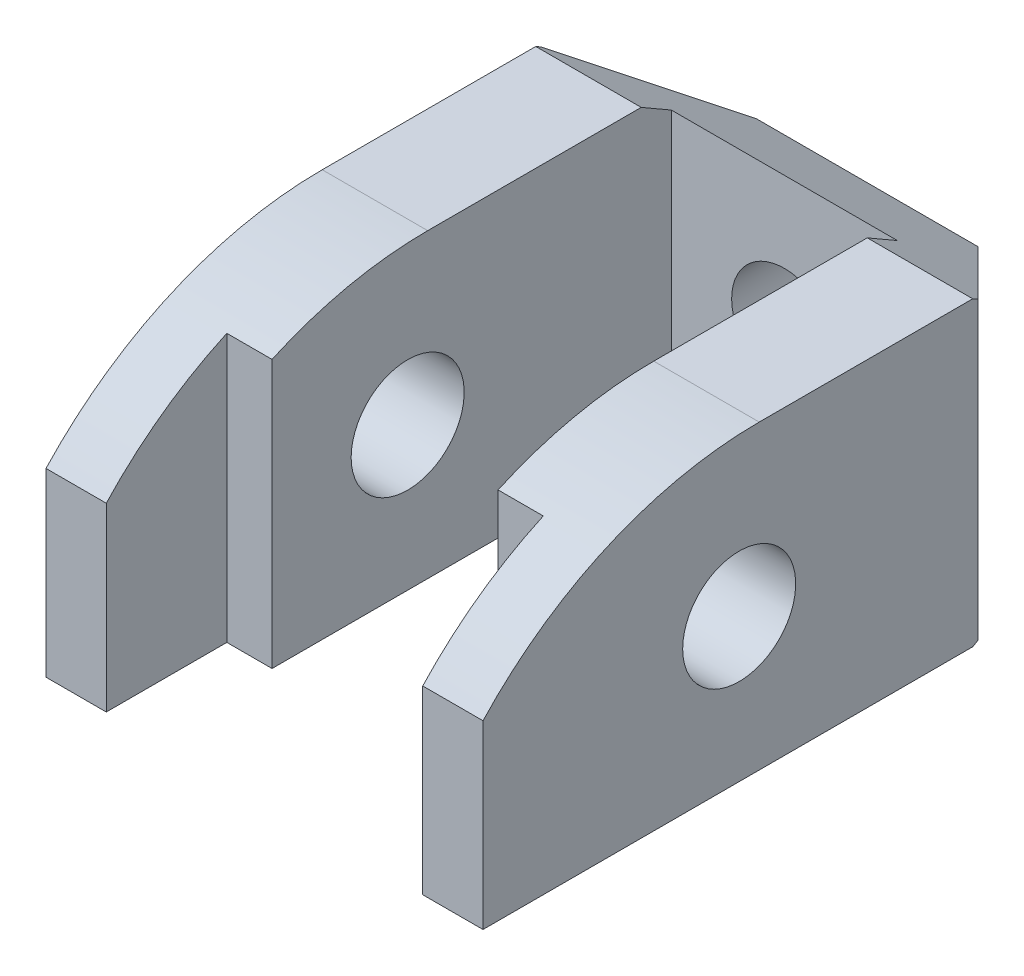
ISO-10303-21;
HEADER;
FILE_DESCRIPTION(('STEP AP214'),'2;1');
FILE_NAME('part.step','',(''),(''),'','','');
FILE_SCHEMA(('AUTOMOTIVE_DESIGN { 1 0 10303 214 1 1 1 1 }'));
ENDSEC;
DATA;
#1=APPLICATION_CONTEXT('core data for automotive mechanical design processes');
#2=APPLICATION_PROTOCOL_DEFINITION('international standard','automotive_design',2000,#1);
#3=PRODUCT_CONTEXT('',#1,'mechanical');
#4=PRODUCT('Part','Part','',(#3));
#5=PRODUCT_RELATED_PRODUCT_CATEGORY('part','',(#4));
#6=PRODUCT_DEFINITION_FORMATION('','',#4);
#7=PRODUCT_DEFINITION_CONTEXT('part definition',#1,'design');
#8=PRODUCT_DEFINITION('design','',#6,#7);
#9=PRODUCT_DEFINITION_SHAPE('','',#8);
#10=(LENGTH_UNIT() NAMED_UNIT(*) SI_UNIT(.MILLI.,.METRE.));
#11=(NAMED_UNIT(*) PLANE_ANGLE_UNIT() SI_UNIT($,.RADIAN.));
#12=(NAMED_UNIT(*) SI_UNIT($,.STERADIAN.) SOLID_ANGLE_UNIT());
#13=UNCERTAINTY_MEASURE_WITH_UNIT(LENGTH_MEASURE(1.E-05),#10,'distance_accuracy_value','');
#14=(GEOMETRIC_REPRESENTATION_CONTEXT(3) GLOBAL_UNCERTAINTY_ASSIGNED_CONTEXT((#13)) GLOBAL_UNIT_ASSIGNED_CONTEXT((#10,
#11,#12)) REPRESENTATION_CONTEXT('',''));
#15=CARTESIAN_POINT('',(0.,0.,0.));
#16=DIRECTION('',(0.,0.,1.));
#17=DIRECTION('',(1.,0.,0.));
#18=AXIS2_PLACEMENT_3D('',#15,#16,#17);
#19=CARTESIAN_POINT('',(58.,0.,-65.));
#20=DIRECTION('',(0.,0.866025403784438,0.500000000000001));
#21=DIRECTION('',(0.,-0.500000000000001,0.866025403784438));
#22=AXIS2_PLACEMENT_3D('',#19,#20,#21);
#23=PLANE('',#22);
#24=DIRECTION('',(-0.654653670707973,-0.37796447300923,0.65465367070798));
#25=VECTOR('',#24,1.);
#26=CARTESIAN_POINT('',(24.4590496401407,14.5236575393553,-90.1557127698941));
#27=LINE('',#26,#25);
#28=CARTESIAN_POINT('',(14.3033368702467,8.66025403784441,-80.));
#29=VERTEX_POINT('',#28);
#30=CARTESIAN_POINT('',(0.,0.402218645497464,-65.6966631297531));
#31=VERTEX_POINT('',#30);
#32=EDGE_CURVE('E264',#29,#31,#27,.T.);
#33=ORIENTED_EDGE('',*,*,#32,.F.);
#34=DIRECTION('',(-1.,0.,0.));
#35=VECTOR('',#34,1.);
#36=CARTESIAN_POINT('',(58.,8.66025403784441,-80.));
#37=LINE('',#36,#35);
#38=CARTESIAN_POINT('',(43.6966631297533,8.66025403784441,-80.));
#39=VERTEX_POINT('',#38);
#40=EDGE_CURVE('E235',#39,#29,#37,.T.);
#41=ORIENTED_EDGE('',*,*,#40,.F.);
#42=DIRECTION('',(0.654653670707972,-0.377964473009231,0.654653670707981));
#43=VECTOR('',#42,1.);
#44=CARTESIAN_POINT('',(58.3980932170018,0.172379419498898,-65.2985699127513));
#45=LINE('',#44,#43);
#46=CARTESIAN_POINT('',(58.,0.402218645497436,-65.6966631297531));
#47=VERTEX_POINT('',#46);
#48=EDGE_CURVE('E52',#39,#47,#45,.T.);
#49=ORIENTED_EDGE('',*,*,#48,.T.);
#50=DIRECTION('',(0.,0.500000000000001,-0.866025403784438));
#51=VECTOR('',#50,1.);
#52=CARTESIAN_POINT('',(58.,0.,-65.));
#53=LINE('',#52,#51);
#54=CARTESIAN_POINT('',(58.,0.,-65.));
#55=VERTEX_POINT('',#54);
#56=EDGE_CURVE('E188',#55,#47,#53,.T.);
#57=ORIENTED_EDGE('',*,*,#56,.F.);
#58=DIRECTION('',(-1.,0.,0.));
#59=VECTOR('',#58,1.);
#60=CARTESIAN_POINT('',(58.,0.,-65.));
#61=LINE('',#60,#59);
#62=CARTESIAN_POINT('',(44.,0.,-65.));
#63=VERTEX_POINT('',#62);
#64=EDGE_CURVE('E239',#55,#63,#61,.T.);
#65=ORIENTED_EDGE('',*,*,#64,.T.);
#66=DIRECTION('',(0.,0.500000000000001,-0.866025403784438));
#67=VECTOR('',#66,1.);
#68=CARTESIAN_POINT('',(44.,0.,-65.));
#69=LINE('',#68,#67);
#70=CARTESIAN_POINT('',(44.,2.30940107675851,-69.));
#71=VERTEX_POINT('',#70);
#72=EDGE_CURVE('E317',#63,#71,#69,.T.);
#73=ORIENTED_EDGE('',*,*,#72,.T.);
#74=DIRECTION('',(-1.,0.,0.));
#75=VECTOR('',#74,1.);
#76=CARTESIAN_POINT('',(58.,2.30940107675851,-69.));
#77=LINE('',#76,#75);
#78=CARTESIAN_POINT('',(14.,2.30940107675852,-69.));
#79=VERTEX_POINT('',#78);
#80=EDGE_CURVE('E330',#71,#79,#77,.T.);
#81=ORIENTED_EDGE('',*,*,#80,.T.);
#82=DIRECTION('',(0.,0.500000000000001,-0.866025403784438));
#83=VECTOR('',#82,1.);
#84=CARTESIAN_POINT('',(14.,0.,-65.));
#85=LINE('',#84,#83);
#86=CARTESIAN_POINT('',(14.,0.,-65.));
#87=VERTEX_POINT('',#86);
#88=EDGE_CURVE('E326',#87,#79,#85,.T.);
#89=ORIENTED_EDGE('',*,*,#88,.F.);
#90=CARTESIAN_POINT('',(0.,0.,-65.));
#91=VERTEX_POINT('',#90);
#92=EDGE_CURVE('E238',#87,#91,#61,.T.);
#93=ORIENTED_EDGE('',*,*,#92,.T.);
#94=DIRECTION('',(0.,0.500000000000001,-0.866025403784438));
#95=VECTOR('',#94,1.);
#96=CARTESIAN_POINT('',(0.,0.,-65.));
#97=LINE('',#96,#95);
#98=EDGE_CURVE('E212',#91,#31,#97,.T.);
#99=ORIENTED_EDGE('',*,*,#98,.T.);
#100=EDGE_LOOP('',(#33,#41,#49,#57,#65,#73,#81,#89,#93,#99));
#101=FACE_BOUND('',#100,.T.);
#102=ADVANCED_FACE('F36',(#101),#23,.F.);
#103=CARTESIAN_POINT('',(58.,31.3397459621557,-80.));
#104=DIRECTION('',(0.,-0.866025403784442,0.499999999999994));
#105=DIRECTION('',(0.,-0.499999999999994,-0.866025403784442));
#106=AXIS2_PLACEMENT_3D('',#103,#104,#105);
#107=PLANE('',#106);
#108=DIRECTION('',(0.654653670707975,-0.377964473009224,-0.654653670707982));
#109=VECTOR('',#108,1.);
#110=CARTESIAN_POINT('',(33.0304782115694,20.527625867591,-98.7271413413229));
#111=LINE('',#110,#109);
#112=CARTESIAN_POINT('',(0.,39.5977813545025,-65.6966631297531));
#113=VERTEX_POINT('',#112);
#114=CARTESIAN_POINT('',(14.3033368702467,31.3397459621557,-80.));
#115=VERTEX_POINT('',#114);
#116=EDGE_CURVE('E59',#113,#115,#111,.T.);
#117=ORIENTED_EDGE('',*,*,#116,.F.);
#118=DIRECTION('',(0.,0.499999999999994,0.866025403784442));
#119=VECTOR('',#118,1.);
#120=CARTESIAN_POINT('',(0.,31.3397459621557,-80.));
#121=LINE('',#120,#119);
#122=CARTESIAN_POINT('',(0.,40.,-65.));
#123=VERTEX_POINT('',#122);
#124=EDGE_CURVE('E215',#113,#123,#121,.T.);
#125=ORIENTED_EDGE('',*,*,#124,.T.);
#126=DIRECTION('',(-1.,0.,0.));
#127=VECTOR('',#126,1.);
#128=CARTESIAN_POINT('',(58.,40.,-65.));
#129=LINE('',#128,#127);
#130=CARTESIAN_POINT('',(14.,40.,-65.));
#131=VERTEX_POINT('',#130);
#132=EDGE_CURVE('E231',#131,#123,#129,.T.);
#133=ORIENTED_EDGE('',*,*,#132,.F.);
#134=DIRECTION('',(0.,0.499999999999994,0.866025403784442));
#135=VECTOR('',#134,1.);
#136=CARTESIAN_POINT('',(14.,31.3397459621557,-80.));
#137=LINE('',#136,#135);
#138=CARTESIAN_POINT('',(14.,37.6905989232415,-69.));
#139=VERTEX_POINT('',#138);
#140=EDGE_CURVE('E324',#139,#131,#137,.T.);
#141=ORIENTED_EDGE('',*,*,#140,.F.);
#142=DIRECTION('',(1.,0.,0.));
#143=VECTOR('',#142,1.);
#144=CARTESIAN_POINT('',(58.,37.6905989232415,-69.));
#145=LINE('',#144,#143);
#146=CARTESIAN_POINT('',(44.,37.6905989232415,-69.));
#147=VERTEX_POINT('',#146);
#148=EDGE_CURVE('E246',#139,#147,#145,.T.);
#149=ORIENTED_EDGE('',*,*,#148,.T.);
#150=DIRECTION('',(0.,0.499999999999994,0.866025403784442));
#151=VECTOR('',#150,1.);
#152=CARTESIAN_POINT('',(44.,31.3397459621557,-80.));
#153=LINE('',#152,#151);
#154=CARTESIAN_POINT('',(44.,40.,-65.));
#155=VERTEX_POINT('',#154);
#156=EDGE_CURVE('E315',#147,#155,#153,.T.);
#157=ORIENTED_EDGE('',*,*,#156,.T.);
#158=CARTESIAN_POINT('',(58.,40.,-65.));
#159=VERTEX_POINT('',#158);
#160=EDGE_CURVE('E193',#159,#155,#129,.T.);
#161=ORIENTED_EDGE('',*,*,#160,.F.);
#162=DIRECTION('',(0.,0.499999999999994,0.866025403784442));
#163=VECTOR('',#162,1.);
#164=CARTESIAN_POINT('',(58.,31.3397459621557,-80.));
#165=LINE('',#164,#163);
#166=CARTESIAN_POINT('',(58.,39.5977813545026,-65.6966631297531));
#167=VERTEX_POINT('',#166);
#168=EDGE_CURVE('E185',#167,#159,#165,.T.);
#169=ORIENTED_EDGE('',*,*,#168,.F.);
#170=DIRECTION('',(-0.654653670707973,-0.377964473009224,-0.654653670707983));
#171=VECTOR('',#170,1.);
#172=CARTESIAN_POINT('',(49.8266646455732,34.8789039874472,-73.86999848418));
#173=LINE('',#172,#171);
#174=CARTESIAN_POINT('',(43.6966631297533,31.3397459621557,-80.));
#175=VERTEX_POINT('',#174);
#176=EDGE_CURVE('E171',#167,#175,#173,.T.);
#177=ORIENTED_EDGE('',*,*,#176,.T.);
#178=DIRECTION('',(-1.,0.,0.));
#179=VECTOR('',#178,1.);
#180=CARTESIAN_POINT('',(58.,31.3397459621557,-80.));
#181=LINE('',#180,#179);
#182=EDGE_CURVE('E233',#175,#115,#181,.T.);
#183=ORIENTED_EDGE('',*,*,#182,.T.);
#184=EDGE_LOOP('',(#117,#125,#133,#141,#149,#157,#161,#169,#177,#183));
#185=FACE_BOUND('',#184,.T.);
#186=ADVANCED_FACE('F190',(#185),#107,.F.);
#187=CARTESIAN_POINT('',(0.,-10.,-36.6606055596467));
#188=DIRECTION('',(1.,0.,0.));
#189=DIRECTION('',(0.,0.,-1.));
#190=AXIS2_PLACEMENT_3D('',#187,#188,#189);
#191=PLANE('',#190);
#192=CARTESIAN_POINT('',(0.,19.,-34.));
#193=DIRECTION('',(1.,0.,0.));
#194=DIRECTION('',(0.,0.,-1.));
#195=AXIS2_PLACEMENT_3D('',#192,#193,#194);
#196=CIRCLE('',#195,7.5);
#197=CARTESIAN_POINT('',(0.,19.,-26.5));
#198=VERTEX_POINT('',#197);
#199=EDGE_CURVE('E333',#198,#198,#196,.T.);
#200=ORIENTED_EDGE('',*,*,#199,.T.);
#201=EDGE_LOOP('',(#200));
#202=FACE_BOUND('',#201,.T.);
#203=DIRECTION('',(0.,-1.,0.));
#204=VECTOR('',#203,1.);
#205=CARTESIAN_POINT('',(0.,40.,-65.6966631297531));
#206=LINE('',#205,#204);
#207=EDGE_CURVE('E179',#113,#31,#206,.T.);
#208=ORIENTED_EDGE('',*,*,#207,.T.);
#209=ORIENTED_EDGE('',*,*,#98,.F.);
#210=DIRECTION('',(0.,0.,-1.));
#211=VECTOR('',#210,1.);
#212=CARTESIAN_POINT('',(0.,0.,0.));
#213=LINE('',#212,#211);
#214=CARTESIAN_POINT('',(0.,0.,0.));
#215=VERTEX_POINT('',#214);
#216=EDGE_CURVE('E208',#215,#91,#213,.T.);
#217=ORIENTED_EDGE('',*,*,#216,.F.);
#218=DIRECTION('',(0.,-1.,0.));
#219=VECTOR('',#218,1.);
#220=CARTESIAN_POINT('',(0.,0.,0.));
#221=LINE('',#220,#219);
#222=CARTESIAN_POINT('',(0.,24.,0.));
#223=VERTEX_POINT('',#222);
#224=EDGE_CURVE('E205',#223,#215,#221,.T.);
#225=ORIENTED_EDGE('',*,*,#224,.F.);
#226=CARTESIAN_POINT('',(0.,-10.,-36.6606055596467));
#227=DIRECTION('',(1.,0.,0.));
#228=DIRECTION('',(0.,0.,-1.));
#229=AXIS2_PLACEMENT_3D('',#226,#227,#228);
#230=CIRCLE('',#229,50.);
#231=CARTESIAN_POINT('',(0.,40.,-36.6606055596467));
#232=VERTEX_POINT('',#231);
#233=EDGE_CURVE('E220',#232,#223,#230,.T.);
#234=ORIENTED_EDGE('',*,*,#233,.F.);
#235=DIRECTION('',(0.,0.,1.));
#236=VECTOR('',#235,1.);
#237=CARTESIAN_POINT('',(0.,40.,-65.));
#238=LINE('',#237,#236);
#239=EDGE_CURVE('E217',#123,#232,#238,.T.);
#240=ORIENTED_EDGE('',*,*,#239,.F.);
#241=ORIENTED_EDGE('',*,*,#124,.F.);
#242=EDGE_LOOP('',(#208,#209,#217,#225,#234,#240,#241));
#243=FACE_BOUND('',#242,.T.);
#244=ADVANCED_FACE('F368',(#202,#243),#191,.F.);
#245=CARTESIAN_POINT('',(58.,8.66025403784441,-80.));
#246=DIRECTION('',(0.,0.,1.));
#247=DIRECTION('',(1.,0.,0.));
#248=AXIS2_PLACEMENT_3D('',#245,#246,#247);
#249=PLANE('',#248);
#250=CARTESIAN_POINT('',(29.,20.0000000000001,-80.));
#251=DIRECTION('',(0.,0.,-1.));
#252=DIRECTION('',(-1.,0.,0.));
#253=AXIS2_PLACEMENT_3D('',#250,#251,#252);
#254=CIRCLE('',#253,7.);
#255=CARTESIAN_POINT('',(22.,20.0000000000001,-80.));
#256=VERTEX_POINT('',#255);
#257=EDGE_CURVE('E386',#256,#256,#254,.T.);
#258=ORIENTED_EDGE('',*,*,#257,.F.);
#259=EDGE_LOOP('',(#258));
#260=FACE_BOUND('',#259,.T.);
#261=DIRECTION('',(0.,-1.,0.));
#262=VECTOR('',#261,1.);
#263=CARTESIAN_POINT('',(14.3033368702467,8.66025403784441,-80.));
#264=LINE('',#263,#262);
#265=EDGE_CURVE('E12',#115,#29,#264,.T.);
#266=ORIENTED_EDGE('',*,*,#265,.F.);
#267=ORIENTED_EDGE('',*,*,#182,.F.);
#268=DIRECTION('',(0.,-1.,0.));
#269=VECTOR('',#268,1.);
#270=CARTESIAN_POINT('',(43.6966631297533,8.66025403784441,-80.));
#271=LINE('',#270,#269);
#272=EDGE_CURVE('E45',#175,#39,#271,.T.);
#273=ORIENTED_EDGE('',*,*,#272,.T.);
#274=ORIENTED_EDGE('',*,*,#40,.T.);
#275=EDGE_LOOP('',(#266,#267,#273,#274));
#276=FACE_BOUND('',#275,.T.);
#277=ADVANCED_FACE('F261',(#260,#276),#249,.F.);
#278=CARTESIAN_POINT('',(58.,0.,0.));
#279=DIRECTION('',(0.,1.,0.));
#280=DIRECTION('',(0.,0.,1.));
#281=AXIS2_PLACEMENT_3D('',#278,#279,#280);
#282=PLANE('',#281);
#283=DIRECTION('',(0.,0.,1.));
#284=VECTOR('',#283,1.);
#285=CARTESIAN_POINT('',(50.,0.,0.));
#286=LINE('',#285,#284);
#287=CARTESIAN_POINT('',(50.,0.,-16.));
#288=VERTEX_POINT('',#287);
#289=CARTESIAN_POINT('',(50.,0.,0.));
#290=VERTEX_POINT('',#289);
#291=EDGE_CURVE('E297',#288,#290,#286,.T.);
#292=ORIENTED_EDGE('',*,*,#291,.F.);
#293=DIRECTION('',(-1.,0.,0.));
#294=VECTOR('',#293,1.);
#295=CARTESIAN_POINT('',(58.,0.,-16.));
#296=LINE('',#295,#294);
#297=CARTESIAN_POINT('',(44.,0.,-16.));
#298=VERTEX_POINT('',#297);
#299=EDGE_CURVE('E291',#288,#298,#296,.T.);
#300=ORIENTED_EDGE('',*,*,#299,.T.);
#301=DIRECTION('',(0.,0.,-1.));
#302=VECTOR('',#301,1.);
#303=CARTESIAN_POINT('',(44.,0.,0.));
#304=LINE('',#303,#302);
#305=EDGE_CURVE('E256',#298,#63,#304,.T.);
#306=ORIENTED_EDGE('',*,*,#305,.T.);
#307=ORIENTED_EDGE('',*,*,#64,.F.);
#308=DIRECTION('',(0.,0.,-1.));
#309=VECTOR('',#308,1.);
#310=CARTESIAN_POINT('',(58.,0.,0.));
#311=LINE('',#310,#309);
#312=CARTESIAN_POINT('',(58.,0.,0.));
#313=VERTEX_POINT('',#312);
#314=EDGE_CURVE('E199',#313,#55,#311,.T.);
#315=ORIENTED_EDGE('',*,*,#314,.F.);
#316=DIRECTION('',(-1.,0.,0.));
#317=VECTOR('',#316,1.);
#318=CARTESIAN_POINT('',(58.,0.,0.));
#319=LINE('',#318,#317);
#320=EDGE_CURVE('E243',#313,#290,#319,.T.);
#321=ORIENTED_EDGE('',*,*,#320,.T.);
#322=EDGE_LOOP('',(#292,#300,#306,#307,#315,#321));
#323=FACE_BOUND('',#322,.T.);
#324=ADVANCED_FACE('F344',(#323),#282,.F.);
#325=CARTESIAN_POINT('',(58.,-10.,-36.6606055596467));
#326=DIRECTION('',(-1.,0.,0.));
#327=DIRECTION('',(0.,0.,1.));
#328=AXIS2_PLACEMENT_3D('',#325,#326,#327);
#329=CYLINDRICAL_SURFACE('',#328,50.);
#330=CARTESIAN_POINT('',(50.,-10.,-36.6606055596467));
#331=DIRECTION('',(-1.,0.,0.));
#332=DIRECTION('',(0.,0.,1.));
#333=AXIS2_PLACEMENT_3D('',#330,#331,#332);
#334=CIRCLE('',#333,50.);
#335=CARTESIAN_POINT('',(50.,35.5317403347236,-16.));
#336=VERTEX_POINT('',#335);
#337=CARTESIAN_POINT('',(50.,24.,0.));
#338=VERTEX_POINT('',#337);
#339=EDGE_CURVE('E274',#336,#338,#334,.F.);
#340=ORIENTED_EDGE('',*,*,#339,.T.);
#341=DIRECTION('',(-1.,0.,0.));
#342=VECTOR('',#341,1.);
#343=CARTESIAN_POINT('',(58.,24.,0.));
#344=LINE('',#343,#342);
#345=CARTESIAN_POINT('',(58.,24.,0.));
#346=VERTEX_POINT('',#345);
#347=EDGE_CURVE('E224',#346,#338,#344,.T.);
#348=ORIENTED_EDGE('',*,*,#347,.F.);
#349=CARTESIAN_POINT('',(58.,-10.,-36.6606055596467));
#350=DIRECTION('',(1.,0.,0.));
#351=DIRECTION('',(0.,0.,-1.));
#352=AXIS2_PLACEMENT_3D('',#349,#350,#351);
#353=CIRCLE('',#352,50.);
#354=CARTESIAN_POINT('',(58.,40.,-36.6606055596467));
#355=VERTEX_POINT('',#354);
#356=EDGE_CURVE('E197',#355,#346,#353,.T.);
#357=ORIENTED_EDGE('',*,*,#356,.F.);
#358=DIRECTION('',(-1.,0.,0.));
#359=VECTOR('',#358,1.);
#360=CARTESIAN_POINT('',(58.,40.,-36.6606055596467));
#361=LINE('',#360,#359);
#362=CARTESIAN_POINT('',(44.,40.,-36.6606055596467));
#363=VERTEX_POINT('',#362);
#364=EDGE_CURVE('E228',#355,#363,#361,.T.);
#365=ORIENTED_EDGE('',*,*,#364,.T.);
#366=CARTESIAN_POINT('',(44.,-10.,-36.6606055596467));
#367=DIRECTION('',(1.,0.,0.));
#368=DIRECTION('',(0.,0.,-1.));
#369=AXIS2_PLACEMENT_3D('',#366,#367,#368);
#370=CIRCLE('',#369,50.);
#371=CARTESIAN_POINT('',(44.,35.5317403347236,-16.));
#372=VERTEX_POINT('',#371);
#373=EDGE_CURVE('E250',#363,#372,#370,.T.);
#374=ORIENTED_EDGE('',*,*,#373,.T.);
#375=DIRECTION('',(-1.,0.,0.));
#376=VECTOR('',#375,1.);
#377=CARTESIAN_POINT('',(58.,35.5317403347236,-16.));
#378=LINE('',#377,#376);
#379=EDGE_CURVE('E269',#336,#372,#378,.T.);
#380=ORIENTED_EDGE('',*,*,#379,.F.);
#381=EDGE_LOOP('',(#340,#348,#357,#365,#374,#380));
#382=FACE_BOUND('',#381,.T.);
#383=ADVANCED_FACE('F419',(#382),#329,.T.);
#384=CARTESIAN_POINT('',(58.,0.,0.));
#385=DIRECTION('',(0.,0.,-1.));
#386=DIRECTION('',(-1.,0.,0.));
#387=AXIS2_PLACEMENT_3D('',#384,#385,#386);
#388=PLANE('',#387);
#389=DIRECTION('',(0.,-1.,0.));
#390=VECTOR('',#389,1.);
#391=CARTESIAN_POINT('',(50.,40.001,0.));
#392=LINE('',#391,#390);
#393=EDGE_CURVE('E285',#338,#290,#392,.T.);
#394=ORIENTED_EDGE('',*,*,#393,.T.);
#395=ORIENTED_EDGE('',*,*,#320,.F.);
#396=DIRECTION('',(0.,-1.,0.));
#397=VECTOR('',#396,1.);
#398=CARTESIAN_POINT('',(58.,0.,0.));
#399=LINE('',#398,#397);
#400=EDGE_CURVE('E223',#346,#313,#399,.T.);
#401=ORIENTED_EDGE('',*,*,#400,.F.);
#402=ORIENTED_EDGE('',*,*,#347,.T.);
#403=EDGE_LOOP('',(#394,#395,#401,#402));
#404=FACE_BOUND('',#403,.T.);
#405=ADVANCED_FACE('F411',(#404),#388,.F.);
#406=DIRECTION('',(0.,0.,-1.));
#407=VECTOR('',#406,1.);
#408=CARTESIAN_POINT('',(14.,0.,0.));
#409=LINE('',#408,#407);
#410=CARTESIAN_POINT('',(14.,0.,-16.));
#411=VERTEX_POINT('',#410);
#412=EDGE_CURVE('E328',#411,#87,#409,.T.);
#413=ORIENTED_EDGE('',*,*,#412,.F.);
#414=CARTESIAN_POINT('',(8.00000000000001,0.,-16.));
#415=VERTEX_POINT('',#414);
#416=EDGE_CURVE('E290',#411,#415,#296,.T.);
#417=ORIENTED_EDGE('',*,*,#416,.T.);
#418=DIRECTION('',(0.,0.,1.));
#419=VECTOR('',#418,1.);
#420=CARTESIAN_POINT('',(8.00000000000001,0.,0.));
#421=LINE('',#420,#419);
#422=CARTESIAN_POINT('',(8.00000000000001,0.,0.));
#423=VERTEX_POINT('',#422);
#424=EDGE_CURVE('E294',#415,#423,#421,.T.);
#425=ORIENTED_EDGE('',*,*,#424,.T.);
#426=EDGE_CURVE('E242',#423,#215,#319,.T.);
#427=ORIENTED_EDGE('',*,*,#426,.T.);
#428=ORIENTED_EDGE('',*,*,#216,.T.);
#429=ORIENTED_EDGE('',*,*,#92,.F.);
#430=EDGE_LOOP('',(#413,#417,#425,#427,#428,#429));
#431=FACE_BOUND('',#430,.T.);
#432=ADVANCED_FACE('F382',(#431),#282,.F.);
#433=CARTESIAN_POINT('',(58.,40.,-65.));
#434=DIRECTION('',(0.,-1.,0.));
#435=DIRECTION('',(0.,0.,-1.));
#436=AXIS2_PLACEMENT_3D('',#433,#434,#435);
#437=PLANE('',#436);
#438=DIRECTION('',(0.,0.,1.));
#439=VECTOR('',#438,1.);
#440=CARTESIAN_POINT('',(14.,40.,-69.));
#441=LINE('',#440,#439);
#442=CARTESIAN_POINT('',(14.,40.,-36.6606055596467));
#443=VERTEX_POINT('',#442);
#444=EDGE_CURVE('E302',#131,#443,#441,.T.);
#445=ORIENTED_EDGE('',*,*,#444,.F.);
#446=ORIENTED_EDGE('',*,*,#132,.T.);
#447=ORIENTED_EDGE('',*,*,#239,.T.);
#448=EDGE_CURVE('E227',#443,#232,#361,.T.);
#449=ORIENTED_EDGE('',*,*,#448,.F.);
#450=EDGE_LOOP('',(#445,#446,#447,#449));
#451=FACE_BOUND('',#450,.T.);
#452=ADVANCED_FACE('F364',(#451),#437,.F.);
#453=CARTESIAN_POINT('',(8.00000000000001,-10.,-36.6606055596467));
#454=DIRECTION('',(-1.,0.,0.));
#455=DIRECTION('',(0.,0.,1.));
#456=AXIS2_PLACEMENT_3D('',#453,#454,#455);
#457=CIRCLE('',#456,50.);
#458=CARTESIAN_POINT('',(8.00000000000001,35.5317403347236,-16.));
#459=VERTEX_POINT('',#458);
#460=CARTESIAN_POINT('',(8.00000000000003,24.,0.));
#461=VERTEX_POINT('',#460);
#462=EDGE_CURVE('E288',#459,#461,#457,.F.);
#463=ORIENTED_EDGE('',*,*,#462,.F.);
#464=CARTESIAN_POINT('',(14.,35.5317403347236,-16.));
#465=VERTEX_POINT('',#464);
#466=EDGE_CURVE('E267',#465,#459,#378,.T.);
#467=ORIENTED_EDGE('',*,*,#466,.F.);
#468=CARTESIAN_POINT('',(14.,-10.,-36.6606055596467));
#469=DIRECTION('',(1.,0.,0.));
#470=DIRECTION('',(0.,0.,-1.));
#471=AXIS2_PLACEMENT_3D('',#468,#469,#470);
#472=CIRCLE('',#471,50.);
#473=EDGE_CURVE('E255',#443,#465,#472,.T.);
#474=ORIENTED_EDGE('',*,*,#473,.F.);
#475=ORIENTED_EDGE('',*,*,#448,.T.);
#476=ORIENTED_EDGE('',*,*,#233,.T.);
#477=EDGE_CURVE('E204',#461,#223,#344,.T.);
#478=ORIENTED_EDGE('',*,*,#477,.F.);
#479=EDGE_LOOP('',(#463,#467,#474,#475,#476,#478));
#480=FACE_BOUND('',#479,.T.);
#481=ADVANCED_FACE('F374',(#480),#329,.T.);
#482=CARTESIAN_POINT('',(58.,19.,-34.));
#483=DIRECTION('',(-1.,0.,0.));
#484=DIRECTION('',(0.,0.,1.));
#485=AXIS2_PLACEMENT_3D('',#482,#483,#484);
#486=CYLINDRICAL_SURFACE('',#485,7.5);
#487=CARTESIAN_POINT('',(14.,19.,-34.));
#488=DIRECTION('',(1.,0.,0.));
#489=DIRECTION('',(0.,0.,-1.));
#490=AXIS2_PLACEMENT_3D('',#487,#488,#489);
#491=CIRCLE('',#490,7.5);
#492=CARTESIAN_POINT('',(14.,19.,-26.5));
#493=VERTEX_POINT('',#492);
#494=EDGE_CURVE('E252',#493,#493,#491,.T.);
#495=CARTESIAN_POINT('',(0.,19.,-26.5));
#496=CARTESIAN_POINT('',(0.145833333333333,19.,-26.5));
#497=CARTESIAN_POINT('',(0.291666666666667,19.,-26.5));
#498=CARTESIAN_POINT('',(0.583333333333334,19.,-26.5));
#499=CARTESIAN_POINT('',(0.729166666666667,19.,-26.5));
#500=CARTESIAN_POINT('',(1.02083333333333,19.,-26.5));
#501=CARTESIAN_POINT('',(1.16666666666667,19.,-26.5));
#502=CARTESIAN_POINT('',(1.45833333333333,19.,-26.5));
#503=CARTESIAN_POINT('',(1.60416666666667,19.,-26.5));
#504=CARTESIAN_POINT('',(1.89583333333334,19.,-26.5));
#505=CARTESIAN_POINT('',(2.04166666666667,19.,-26.5));
#506=CARTESIAN_POINT('',(2.33333333333334,19.,-26.5));
#507=CARTESIAN_POINT('',(2.47916666666667,19.,-26.5));
#508=CARTESIAN_POINT('',(2.77083333333334,19.,-26.5));
#509=CARTESIAN_POINT('',(2.91666666666667,19.,-26.5));
#510=CARTESIAN_POINT('',(3.20833333333334,19.,-26.5));
#511=CARTESIAN_POINT('',(3.35416666666667,19.,-26.5));
#512=CARTESIAN_POINT('',(3.64583333333334,19.,-26.5));
#513=CARTESIAN_POINT('',(3.79166666666667,19.,-26.5));
#514=CARTESIAN_POINT('',(4.08333333333334,19.,-26.5));
#515=CARTESIAN_POINT('',(4.22916666666667,19.,-26.5));
#516=CARTESIAN_POINT('',(4.52083333333334,19.,-26.5));
#517=CARTESIAN_POINT('',(4.66666666666667,19.,-26.5));
#518=CARTESIAN_POINT('',(4.95833333333334,19.,-26.5));
#519=CARTESIAN_POINT('',(5.10416666666667,19.,-26.5));
#520=CARTESIAN_POINT('',(5.39583333333334,19.,-26.5));
#521=CARTESIAN_POINT('',(5.54166666666667,19.,-26.5));
#522=CARTESIAN_POINT('',(5.83333333333334,19.,-26.5));
#523=CARTESIAN_POINT('',(5.97916666666667,19.,-26.5));
#524=CARTESIAN_POINT('',(6.27083333333334,19.,-26.5));
#525=CARTESIAN_POINT('',(6.41666666666667,19.,-26.5));
#526=CARTESIAN_POINT('',(6.70833333333334,19.,-26.5));
#527=CARTESIAN_POINT('',(6.85416666666667,19.,-26.5));
#528=CARTESIAN_POINT('',(7.14583333333334,19.,-26.5));
#529=CARTESIAN_POINT('',(7.29166666666667,19.,-26.5));
#530=CARTESIAN_POINT('',(7.58333333333334,19.,-26.5));
#531=CARTESIAN_POINT('',(7.72916666666667,19.,-26.5));
#532=CARTESIAN_POINT('',(8.02083333333334,19.,-26.5));
#533=CARTESIAN_POINT('',(8.16666666666667,19.,-26.5));
#534=CARTESIAN_POINT('',(8.45833333333334,19.,-26.5));
#535=CARTESIAN_POINT('',(8.60416666666667,19.,-26.5));
#536=CARTESIAN_POINT('',(8.89583333333334,19.,-26.5));
#537=CARTESIAN_POINT('',(9.04166666666667,19.,-26.5));
#538=CARTESIAN_POINT('',(9.33333333333334,19.,-26.5));
#539=CARTESIAN_POINT('',(9.47916666666667,19.,-26.5));
#540=CARTESIAN_POINT('',(9.77083333333334,19.,-26.5));
#541=CARTESIAN_POINT('',(9.91666666666668,19.,-26.5));
#542=CARTESIAN_POINT('',(10.2083333333333,19.,-26.5));
#543=CARTESIAN_POINT('',(10.3541666666667,19.,-26.5));
#544=CARTESIAN_POINT('',(10.6458333333333,19.,-26.5));
#545=CARTESIAN_POINT('',(10.7916666666667,19.,-26.5));
#546=CARTESIAN_POINT('',(11.0833333333333,19.,-26.5));
#547=CARTESIAN_POINT('',(11.2291666666667,19.,-26.5));
#548=CARTESIAN_POINT('',(11.5208333333333,19.,-26.5));
#549=CARTESIAN_POINT('',(11.6666666666667,19.,-26.5));
#550=CARTESIAN_POINT('',(11.9583333333333,19.,-26.5));
#551=CARTESIAN_POINT('',(12.1041666666667,19.,-26.5));
#552=CARTESIAN_POINT('',(12.3958333333333,19.,-26.5));
#553=CARTESIAN_POINT('',(12.5416666666667,19.,-26.5));
#554=CARTESIAN_POINT('',(12.8333333333333,19.,-26.5));
#555=CARTESIAN_POINT('',(12.9791666666667,19.,-26.5));
#556=CARTESIAN_POINT('',(13.2708333333333,19.,-26.5));
#557=CARTESIAN_POINT('',(13.4166666666667,19.,-26.5));
#558=CARTESIAN_POINT('',(13.7083333333333,19.,-26.5));
#559=CARTESIAN_POINT('',(13.8541666666667,19.,-26.5));
#560=CARTESIAN_POINT('',(14.,19.,-26.5));
#561=B_SPLINE_CURVE_WITH_KNOTS('',3,(#495,#496,#497,#498,#499,#500,#501,#502,#503,#504,#505,
#506,#507,#508,#509,#510,#511,#512,#513,#514,#515,#516,#517,#518,#519,#520,#521,#522,#523,#524,
#525,#526,#527,#528,#529,#530,#531,#532,#533,#534,#535,#536,#537,#538,#539,#540,#541,#542,#543,
#544,#545,#546,#547,#548,#549,#550,#551,#552,#553,#554,#555,#556,#557,#558,#559,#560),
.UNSPECIFIED.,.F.,.F.,(4,2,2,2,2,2,2,2,2,2,2,2,2,2,2,2,2,2,2,2,2,2,2,2,2,2,2,2,2,2,2,2,4),(0.,
0.4375,0.875000000000001,1.3125,1.75,2.1875,2.625,3.0625,3.5,3.9375,4.375,4.8125,5.25,
5.68750000000001,6.12500000000001,6.56250000000001,7.00000000000001,7.43750000000001,
7.87500000000001,8.31250000000001,8.75000000000001,9.18750000000001,9.62500000000001,10.0625,
10.5,10.9375,11.375,11.8125,12.25,12.6875,13.125,13.5625,14.),.UNSPECIFIED.);
#562=EDGE_CURVE('BSEAM442',#198,#493,#561,.T.);
#563=ORIENTED_EDGE('',*,*,#199,.F.);
#564=ORIENTED_EDGE('',*,*,#494,.T.);
#565=ORIENTED_EDGE('',*,*,#562,.T.);
#566=ORIENTED_EDGE('',*,*,#562,.F.);
#567=EDGE_LOOP('',(#563,#565,#564,#566));
#568=FACE_BOUND('',#567,.T.);
#569=ADVANCED_FACE('F442',(#568),#486,.F.);
#570=CARTESIAN_POINT('',(58.,-10.,-36.6606055596467));
#571=DIRECTION('',(1.,0.,0.));
#572=DIRECTION('',(0.,0.,-1.));
#573=AXIS2_PLACEMENT_3D('',#570,#571,#572);
#574=PLANE('',#573);
#575=DIRECTION('',(0.,-1.,0.));
#576=VECTOR('',#575,1.);
#577=CARTESIAN_POINT('',(58.,40.,-65.6966631297531));
#578=LINE('',#577,#576);
#579=EDGE_CURVE('E174',#167,#47,#578,.T.);
#580=ORIENTED_EDGE('',*,*,#579,.F.);
#581=ORIENTED_EDGE('',*,*,#168,.T.);
#582=DIRECTION('',(0.,0.,1.));
#583=VECTOR('',#582,1.);
#584=CARTESIAN_POINT('',(58.,40.,-65.));
#585=LINE('',#584,#583);
#586=EDGE_CURVE('E195',#159,#355,#585,.T.);
#587=ORIENTED_EDGE('',*,*,#586,.T.);
#588=ORIENTED_EDGE('',*,*,#356,.T.);
#589=ORIENTED_EDGE('',*,*,#400,.T.);
#590=ORIENTED_EDGE('',*,*,#314,.T.);
#591=ORIENTED_EDGE('',*,*,#56,.T.);
#592=EDGE_LOOP('',(#580,#581,#587,#588,#589,#590,#591));
#593=FACE_BOUND('',#592,.T.);
#594=CARTESIAN_POINT('',(58.,19.,-34.));
#595=DIRECTION('',(1.,0.,0.));
#596=DIRECTION('',(0.,0.,-1.));
#597=AXIS2_PLACEMENT_3D('',#594,#595,#596);
#598=CIRCLE('',#597,7.5);
#599=CARTESIAN_POINT('',(58.,19.,-26.5));
#600=VERTEX_POINT('',#599);
#601=EDGE_CURVE('E209',#600,#600,#598,.T.);
#602=ORIENTED_EDGE('',*,*,#601,.F.);
#603=EDGE_LOOP('',(#602));
#604=FACE_BOUND('',#603,.T.);
#605=ADVANCED_FACE('F183',(#593,#604),#574,.T.);
#606=ORIENTED_EDGE('',*,*,#426,.F.);
#607=DIRECTION('',(0.,-1.,0.));
#608=VECTOR('',#607,1.);
#609=CARTESIAN_POINT('',(8.00000000000001,40.001,0.));
#610=LINE('',#609,#608);
#611=EDGE_CURVE('E277',#461,#423,#610,.T.);
#612=ORIENTED_EDGE('',*,*,#611,.F.);
#613=ORIENTED_EDGE('',*,*,#477,.T.);
#614=ORIENTED_EDGE('',*,*,#224,.T.);
#615=EDGE_LOOP('',(#606,#612,#613,#614));
#616=FACE_BOUND('',#615,.T.);
#617=ADVANCED_FACE('F38',(#616),#388,.F.);
#618=ORIENTED_EDGE('',*,*,#160,.T.);
#619=DIRECTION('',(0.,0.,1.));
#620=VECTOR('',#619,1.);
#621=CARTESIAN_POINT('',(44.,40.,-69.));
#622=LINE('',#621,#620);
#623=EDGE_CURVE('E299',#155,#363,#622,.T.);
#624=ORIENTED_EDGE('',*,*,#623,.T.);
#625=ORIENTED_EDGE('',*,*,#364,.F.);
#626=ORIENTED_EDGE('',*,*,#586,.F.);
#627=EDGE_LOOP('',(#618,#624,#625,#626));
#628=FACE_BOUND('',#627,.T.);
#629=ADVANCED_FACE('F418',(#628),#437,.F.);
#630=CARTESIAN_POINT('',(44.,19.,-34.));
#631=DIRECTION('',(1.,0.,0.));
#632=DIRECTION('',(0.,0.,-1.));
#633=AXIS2_PLACEMENT_3D('',#630,#631,#632);
#634=CIRCLE('',#633,7.5);
#635=CARTESIAN_POINT('',(44.,19.,-26.5));
#636=VERTEX_POINT('',#635);
#637=EDGE_CURVE('E247',#636,#636,#634,.T.);
#638=CARTESIAN_POINT('',(44.,19.,-26.5));
#639=CARTESIAN_POINT('',(44.1458333333333,19.,-26.5));
#640=CARTESIAN_POINT('',(44.2916666666667,19.,-26.5));
#641=CARTESIAN_POINT('',(44.5833333333333,19.,-26.5));
#642=CARTESIAN_POINT('',(44.7291666666667,19.,-26.5));
#643=CARTESIAN_POINT('',(45.0208333333333,19.,-26.5));
#644=CARTESIAN_POINT('',(45.1666666666667,19.,-26.5));
#645=CARTESIAN_POINT('',(45.4583333333333,19.,-26.5));
#646=CARTESIAN_POINT('',(45.6041666666667,19.,-26.5));
#647=CARTESIAN_POINT('',(45.8958333333333,19.,-26.5));
#648=CARTESIAN_POINT('',(46.0416666666667,19.,-26.5));
#649=CARTESIAN_POINT('',(46.3333333333333,19.,-26.5));
#650=CARTESIAN_POINT('',(46.4791666666667,19.,-26.5));
#651=CARTESIAN_POINT('',(46.7708333333333,19.,-26.5));
#652=CARTESIAN_POINT('',(46.9166666666667,19.,-26.5));
#653=CARTESIAN_POINT('',(47.2083333333333,19.,-26.5));
#654=CARTESIAN_POINT('',(47.3541666666667,19.,-26.5));
#655=CARTESIAN_POINT('',(47.6458333333333,19.,-26.5));
#656=CARTESIAN_POINT('',(47.7916666666667,19.,-26.5));
#657=CARTESIAN_POINT('',(48.0833333333333,19.,-26.5));
#658=CARTESIAN_POINT('',(48.2291666666667,19.,-26.5));
#659=CARTESIAN_POINT('',(48.5208333333333,19.,-26.5));
#660=CARTESIAN_POINT('',(48.6666666666667,19.,-26.5));
#661=CARTESIAN_POINT('',(48.9583333333333,19.,-26.5));
#662=CARTESIAN_POINT('',(49.1041666666667,19.,-26.5));
#663=CARTESIAN_POINT('',(49.3958333333333,19.,-26.5));
#664=CARTESIAN_POINT('',(49.5416666666667,19.,-26.5));
#665=CARTESIAN_POINT('',(49.8333333333333,19.,-26.5));
#666=CARTESIAN_POINT('',(49.9791666666667,19.,-26.5));
#667=CARTESIAN_POINT('',(50.2708333333333,19.,-26.5));
#668=CARTESIAN_POINT('',(50.4166666666667,19.,-26.5));
#669=CARTESIAN_POINT('',(50.7083333333333,19.,-26.5));
#670=CARTESIAN_POINT('',(50.8541666666667,19.,-26.5));
#671=CARTESIAN_POINT('',(51.1458333333333,19.,-26.5));
#672=CARTESIAN_POINT('',(51.2916666666667,19.,-26.5));
#673=CARTESIAN_POINT('',(51.5833333333333,19.,-26.5));
#674=CARTESIAN_POINT('',(51.7291666666667,19.,-26.5));
#675=CARTESIAN_POINT('',(52.0208333333333,19.,-26.5));
#676=CARTESIAN_POINT('',(52.1666666666667,19.,-26.5));
#677=CARTESIAN_POINT('',(52.4583333333333,19.,-26.5));
#678=CARTESIAN_POINT('',(52.6041666666667,19.,-26.5));
#679=CARTESIAN_POINT('',(52.8958333333333,19.,-26.5));
#680=CARTESIAN_POINT('',(53.0416666666667,19.,-26.5));
#681=CARTESIAN_POINT('',(53.3333333333333,19.,-26.5));
#682=CARTESIAN_POINT('',(53.4791666666667,19.,-26.5));
#683=CARTESIAN_POINT('',(53.7708333333333,19.,-26.5));
#684=CARTESIAN_POINT('',(53.9166666666667,19.,-26.5));
#685=CARTESIAN_POINT('',(54.2083333333333,19.,-26.5));
#686=CARTESIAN_POINT('',(54.3541666666667,19.,-26.5));
#687=CARTESIAN_POINT('',(54.6458333333333,19.,-26.5));
#688=CARTESIAN_POINT('',(54.7916666666667,19.,-26.5));
#689=CARTESIAN_POINT('',(55.0833333333333,19.,-26.5));
#690=CARTESIAN_POINT('',(55.2291666666667,19.,-26.5));
#691=CARTESIAN_POINT('',(55.5208333333333,19.,-26.5));
#692=CARTESIAN_POINT('',(55.6666666666667,19.,-26.5));
#693=CARTESIAN_POINT('',(55.9583333333333,19.,-26.5));
#694=CARTESIAN_POINT('',(56.1041666666667,19.,-26.5));
#695=CARTESIAN_POINT('',(56.3958333333333,19.,-26.5));
#696=CARTESIAN_POINT('',(56.5416666666667,19.,-26.5));
#697=CARTESIAN_POINT('',(56.8333333333333,19.,-26.5));
#698=CARTESIAN_POINT('',(56.9791666666667,19.,-26.5));
#699=CARTESIAN_POINT('',(57.2708333333333,19.,-26.5));
#700=CARTESIAN_POINT('',(57.4166666666667,19.,-26.5));
#701=CARTESIAN_POINT('',(57.7083333333333,19.,-26.5));
#702=CARTESIAN_POINT('',(57.8541666666667,19.,-26.5));
#703=CARTESIAN_POINT('',(58.,19.,-26.5));
#704=B_SPLINE_CURVE_WITH_KNOTS('',3,(#638,#639,#640,#641,#642,#643,#644,#645,#646,#647,#648,
#649,#650,#651,#652,#653,#654,#655,#656,#657,#658,#659,#660,#661,#662,#663,#664,#665,#666,#667,
#668,#669,#670,#671,#672,#673,#674,#675,#676,#677,#678,#679,#680,#681,#682,#683,#684,#685,#686,
#687,#688,#689,#690,#691,#692,#693,#694,#695,#696,#697,#698,#699,#700,#701,#702,#703),
.UNSPECIFIED.,.F.,.F.,(4,2,2,2,2,2,2,2,2,2,2,2,2,2,2,2,2,2,2,2,2,2,2,2,2,2,2,2,2,2,2,2,4),(0.,
0.4375,0.874999999999994,1.31249999999999,1.74999999999999,2.1875,2.625,3.0625,3.5,3.9375,4.375,
4.81249999999999,5.24999999999999,5.68749999999999,6.12499999999999,6.56249999999999,
6.99999999999999,7.43749999999999,7.87499999999999,8.31249999999999,8.74999999999999,
9.18749999999999,9.62499999999999,10.0625,10.5,10.9375,11.375,11.8125,12.25,12.6875,13.125,
13.5625,14.),.UNSPECIFIED.);
#705=EDGE_CURVE('BSEAM444',#636,#600,#704,.T.);
#706=ORIENTED_EDGE('',*,*,#637,.F.);
#707=ORIENTED_EDGE('',*,*,#601,.T.);
#708=ORIENTED_EDGE('',*,*,#705,.T.);
#709=ORIENTED_EDGE('',*,*,#705,.F.);
#710=EDGE_LOOP('',(#706,#708,#707,#709));
#711=FACE_BOUND('',#710,.T.);
#712=ADVANCED_FACE('F444',(#711),#486,.F.);
#713=CARTESIAN_POINT('',(14.,40.,-69.));
#714=DIRECTION('',(0.,0.,-1.));
#715=DIRECTION('',(-1.,0.,0.));
#716=AXIS2_PLACEMENT_3D('',#713,#714,#715);
#717=PLANE('',#716);
#718=CARTESIAN_POINT('',(29.,20.0000000000001,-69.));
#719=DIRECTION('',(0.,0.,-1.));
#720=DIRECTION('',(-1.,0.,0.));
#721=AXIS2_PLACEMENT_3D('',#718,#719,#720);
#722=CIRCLE('',#721,7.);
#723=CARTESIAN_POINT('',(22.,20.0000000000001,-69.));
#724=VERTEX_POINT('',#723);
#725=EDGE_CURVE('E40',#724,#724,#722,.T.);
#726=ORIENTED_EDGE('',*,*,#725,.T.);
#727=EDGE_LOOP('',(#726));
#728=FACE_BOUND('',#727,.T.);
#729=DIRECTION('',(0.,-1.,0.));
#730=VECTOR('',#729,1.);
#731=CARTESIAN_POINT('',(44.,40.,-69.));
#732=LINE('',#731,#730);
#733=EDGE_CURVE('E304',#147,#71,#732,.T.);
#734=ORIENTED_EDGE('',*,*,#733,.F.);
#735=ORIENTED_EDGE('',*,*,#148,.F.);
#736=DIRECTION('',(0.,-1.,0.));
#737=VECTOR('',#736,1.);
#738=CARTESIAN_POINT('',(14.,40.,-69.));
#739=LINE('',#738,#737);
#740=EDGE_CURVE('E251',#139,#79,#739,.T.);
#741=ORIENTED_EDGE('',*,*,#740,.T.);
#742=ORIENTED_EDGE('',*,*,#80,.F.);
#743=EDGE_LOOP('',(#734,#735,#741,#742));
#744=FACE_BOUND('',#743,.T.);
#745=ADVANCED_FACE('F353',(#728,#744),#717,.F.);
#746=CARTESIAN_POINT('',(14.,40.,-69.));
#747=DIRECTION('',(1.,0.,0.));
#748=DIRECTION('',(0.,0.,-1.));
#749=AXIS2_PLACEMENT_3D('',#746,#747,#748);
#750=PLANE('',#749);
#751=ORIENTED_EDGE('',*,*,#494,.F.);
#752=EDGE_LOOP('',(#751));
#753=FACE_BOUND('',#752,.T.);
#754=ORIENTED_EDGE('',*,*,#412,.T.);
#755=ORIENTED_EDGE('',*,*,#88,.T.);
#756=ORIENTED_EDGE('',*,*,#740,.F.);
#757=ORIENTED_EDGE('',*,*,#140,.T.);
#758=ORIENTED_EDGE('',*,*,#444,.T.);
#759=ORIENTED_EDGE('',*,*,#473,.T.);
#760=DIRECTION('',(0.,-1.,0.));
#761=VECTOR('',#760,1.);
#762=CARTESIAN_POINT('',(14.,40.,-16.));
#763=LINE('',#762,#761);
#764=EDGE_CURVE('E307',#465,#411,#763,.T.);
#765=ORIENTED_EDGE('',*,*,#764,.T.);
#766=EDGE_LOOP('',(#754,#755,#756,#757,#758,#759,#765));
#767=FACE_BOUND('',#766,.T.);
#768=ADVANCED_FACE('F357',(#753,#767),#750,.T.);
#769=CARTESIAN_POINT('',(44.,40.,-69.));
#770=DIRECTION('',(1.,0.,0.));
#771=DIRECTION('',(0.,0.,-1.));
#772=AXIS2_PLACEMENT_3D('',#769,#770,#771);
#773=PLANE('',#772);
#774=ORIENTED_EDGE('',*,*,#637,.T.);
#775=EDGE_LOOP('',(#774));
#776=FACE_BOUND('',#775,.T.);
#777=DIRECTION('',(0.,-1.,0.));
#778=VECTOR('',#777,1.);
#779=CARTESIAN_POINT('',(44.,40.,-16.));
#780=LINE('',#779,#778);
#781=EDGE_CURVE('E310',#372,#298,#780,.T.);
#782=ORIENTED_EDGE('',*,*,#781,.F.);
#783=ORIENTED_EDGE('',*,*,#373,.F.);
#784=ORIENTED_EDGE('',*,*,#623,.F.);
#785=ORIENTED_EDGE('',*,*,#156,.F.);
#786=ORIENTED_EDGE('',*,*,#733,.T.);
#787=ORIENTED_EDGE('',*,*,#72,.F.);
#788=ORIENTED_EDGE('',*,*,#305,.F.);
#789=EDGE_LOOP('',(#782,#783,#784,#785,#786,#787,#788));
#790=FACE_BOUND('',#789,.T.);
#791=ADVANCED_FACE('F350',(#776,#790),#773,.F.);
#792=CARTESIAN_POINT('',(0.,40.001,-16.));
#793=DIRECTION('',(0.,0.,-1.));
#794=DIRECTION('',(-1.,0.,0.));
#795=AXIS2_PLACEMENT_3D('',#792,#793,#794);
#796=PLANE('',#795);
#797=DIRECTION('',(0.,-1.,0.));
#798=VECTOR('',#797,1.);
#799=CARTESIAN_POINT('',(50.,40.001,-16.));
#800=LINE('',#799,#798);
#801=EDGE_CURVE('E282',#336,#288,#800,.T.);
#802=ORIENTED_EDGE('',*,*,#801,.F.);
#803=ORIENTED_EDGE('',*,*,#379,.T.);
#804=ORIENTED_EDGE('',*,*,#781,.T.);
#805=ORIENTED_EDGE('',*,*,#299,.F.);
#806=EDGE_LOOP('',(#802,#803,#804,#805));
#807=FACE_BOUND('',#806,.T.);
#808=ADVANCED_FACE('F460',(#807),#796,.F.);
#809=CARTESIAN_POINT('',(50.,40.001,0.));
#810=DIRECTION('',(-1.,0.,0.));
#811=DIRECTION('',(0.,0.,1.));
#812=AXIS2_PLACEMENT_3D('',#809,#810,#811);
#813=PLANE('',#812);
#814=ORIENTED_EDGE('',*,*,#291,.T.);
#815=ORIENTED_EDGE('',*,*,#393,.F.);
#816=ORIENTED_EDGE('',*,*,#339,.F.);
#817=ORIENTED_EDGE('',*,*,#801,.T.);
#818=EDGE_LOOP('',(#814,#815,#816,#817));
#819=FACE_BOUND('',#818,.T.);
#820=ADVANCED_FACE('F458',(#819),#813,.T.);
#821=CARTESIAN_POINT('',(8.00000000000001,40.001,0.));
#822=DIRECTION('',(-1.,0.,0.));
#823=DIRECTION('',(0.,0.,1.));
#824=AXIS2_PLACEMENT_3D('',#821,#822,#823);
#825=PLANE('',#824);
#826=DIRECTION('',(0.,-1.,0.));
#827=VECTOR('',#826,1.);
#828=CARTESIAN_POINT('',(8.00000000000001,40.001,-16.));
#829=LINE('',#828,#827);
#830=EDGE_CURVE('E279',#459,#415,#829,.T.);
#831=ORIENTED_EDGE('',*,*,#830,.F.);
#832=ORIENTED_EDGE('',*,*,#462,.T.);
#833=ORIENTED_EDGE('',*,*,#611,.T.);
#834=ORIENTED_EDGE('',*,*,#424,.F.);
#835=EDGE_LOOP('',(#831,#832,#833,#834));
#836=FACE_BOUND('',#835,.T.);
#837=ADVANCED_FACE('F468',(#836),#825,.F.);
#838=ORIENTED_EDGE('',*,*,#764,.F.);
#839=ORIENTED_EDGE('',*,*,#466,.T.);
#840=ORIENTED_EDGE('',*,*,#830,.T.);
#841=ORIENTED_EDGE('',*,*,#416,.F.);
#842=EDGE_LOOP('',(#838,#839,#840,#841));
#843=FACE_BOUND('',#842,.T.);
#844=ADVANCED_FACE('F463',(#843),#796,.F.);
#845=CARTESIAN_POINT('',(58.,40.,-65.6966631297531));
#846=DIRECTION('',(-0.707106781186553,0.,0.707106781186542));
#847=DIRECTION('',(0.707106781186542,0.,0.707106781186553));
#848=AXIS2_PLACEMENT_3D('',#845,#846,#847);
#849=PLANE('',#848);
#850=ORIENTED_EDGE('',*,*,#272,.F.);
#851=ORIENTED_EDGE('',*,*,#176,.F.);
#852=ORIENTED_EDGE('',*,*,#579,.T.);
#853=ORIENTED_EDGE('',*,*,#48,.F.);
#854=EDGE_LOOP('',(#850,#851,#852,#853));
#855=FACE_BOUND('',#854,.T.);
#856=ADVANCED_FACE('F173',(#855),#849,.F.);
#857=CARTESIAN_POINT('',(0.,40.,-65.6966631297531));
#858=DIRECTION('',(-0.707106781186551,0.,-0.707106781186544));
#859=DIRECTION('',(-0.707106781186544,0.,0.707106781186551));
#860=AXIS2_PLACEMENT_3D('',#857,#858,#859);
#861=PLANE('',#860);
#862=ORIENTED_EDGE('',*,*,#32,.T.);
#863=ORIENTED_EDGE('',*,*,#207,.F.);
#864=ORIENTED_EDGE('',*,*,#116,.T.);
#865=ORIENTED_EDGE('',*,*,#265,.T.);
#866=EDGE_LOOP('',(#862,#863,#864,#865));
#867=FACE_BOUND('',#866,.T.);
#868=ADVANCED_FACE('F396',(#867),#861,.T.);
#869=CARTESIAN_POINT('',(29.,20.0000000000001,0.));
#870=DIRECTION('',(0.,0.,-1.));
#871=DIRECTION('',(-1.,0.,0.));
#872=AXIS2_PLACEMENT_3D('',#869,#870,#871);
#873=CYLINDRICAL_SURFACE('',#872,7.);
#874=ORIENTED_EDGE('',*,*,#257,.T.);
#875=EDGE_LOOP('',(#874));
#876=FACE_BOUND('',#875,.T.);
#877=ORIENTED_EDGE('',*,*,#725,.F.);
#878=EDGE_LOOP('',(#877));
#879=FACE_BOUND('',#878,.T.);
#880=ADVANCED_FACE('F394',(#876,#879),#873,.F.);
#881=CLOSED_SHELL('',(#102,#186,#244,#277,#324,#383,#405,#432,#452,#481,#569,#605,#617,#629,
#712,#745,#768,#791,#808,#820,#837,#844,#856,#868,#880));
#882=MANIFOLD_SOLID_BREP('B2',#881);
#883=ADVANCED_BREP_SHAPE_REPRESENTATION('',(#18,#882),#14);
#884=SHAPE_DEFINITION_REPRESENTATION(#9,#883);
ENDSEC;
END-ISO-10303-21;
